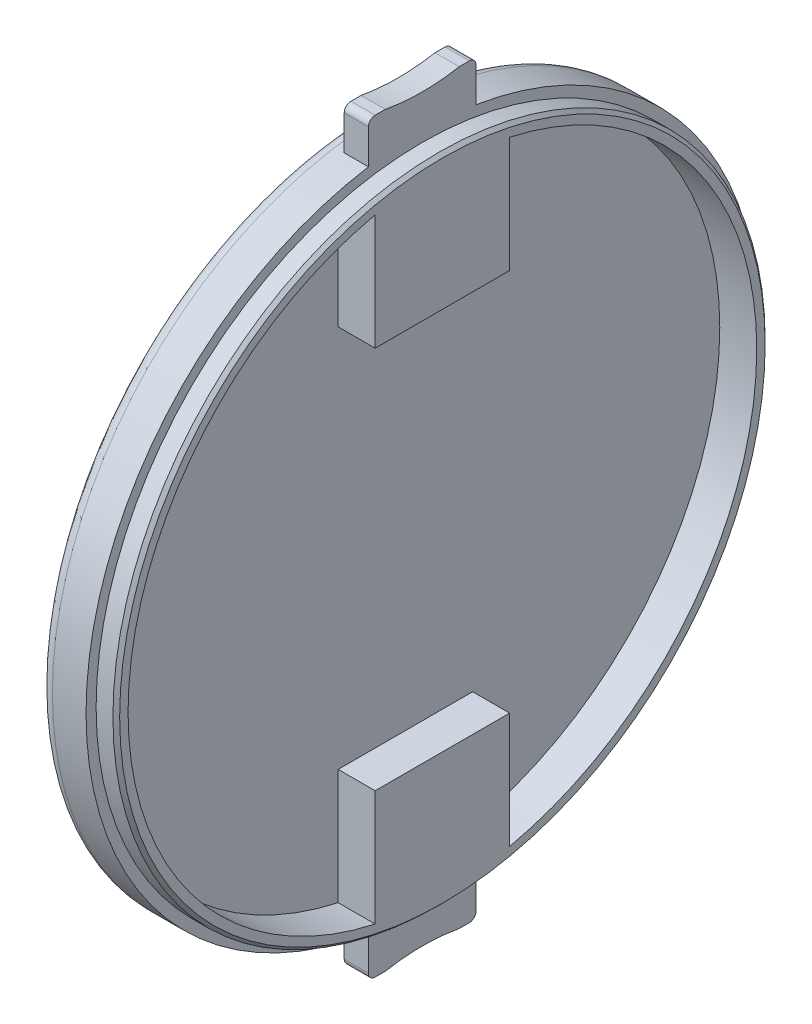
ISO-10303-21;
HEADER;
FILE_DESCRIPTION(('STEP AP214'),'2;1');
FILE_NAME('part.step','',(''),(''),'','','');
FILE_SCHEMA(('AUTOMOTIVE_DESIGN { 1 0 10303 214 1 1 1 1 }'));
ENDSEC;
DATA;
#1=APPLICATION_CONTEXT('core data for automotive mechanical design processes');
#2=APPLICATION_PROTOCOL_DEFINITION('international standard','automotive_design',2000,#1);
#3=PRODUCT_CONTEXT('',#1,'mechanical');
#4=PRODUCT('Part','Part','',(#3));
#5=PRODUCT_RELATED_PRODUCT_CATEGORY('part','',(#4));
#6=PRODUCT_DEFINITION_FORMATION('','',#4);
#7=PRODUCT_DEFINITION_CONTEXT('part definition',#1,'design');
#8=PRODUCT_DEFINITION('design','',#6,#7);
#9=PRODUCT_DEFINITION_SHAPE('','',#8);
#10=(LENGTH_UNIT() NAMED_UNIT(*) SI_UNIT(.MILLI.,.METRE.));
#11=(NAMED_UNIT(*) PLANE_ANGLE_UNIT() SI_UNIT($,.RADIAN.));
#12=(NAMED_UNIT(*) SI_UNIT($,.STERADIAN.) SOLID_ANGLE_UNIT());
#13=UNCERTAINTY_MEASURE_WITH_UNIT(LENGTH_MEASURE(1.E-05),#10,'distance_accuracy_value','');
#14=(GEOMETRIC_REPRESENTATION_CONTEXT(3) GLOBAL_UNCERTAINTY_ASSIGNED_CONTEXT((#13)) GLOBAL_UNIT_ASSIGNED_CONTEXT((#10,
#11,#12)) REPRESENTATION_CONTEXT('',''));
#15=CARTESIAN_POINT('',(0.,0.,0.));
#16=DIRECTION('',(0.,0.,1.));
#17=DIRECTION('',(1.,0.,0.));
#18=AXIS2_PLACEMENT_3D('',#15,#16,#17);
#19=CARTESIAN_POINT('',(0.,0.,0.));
#20=DIRECTION('',(1.,0.,0.));
#21=DIRECTION('',(0.,0.,-1.));
#22=AXIS2_PLACEMENT_3D('',#19,#20,#21);
#23=PLANE('',#22);
#24=DIRECTION('',(0.,0.,1.));
#25=VECTOR('',#24,1.);
#26=CARTESIAN_POINT('',(0.,-28.5,10.));
#27=LINE('',#26,#25);
#28=CARTESIAN_POINT('',(0.,-28.5,-10.));
#29=VERTEX_POINT('',#28);
#30=CARTESIAN_POINT('',(0.,-28.5,10.));
#31=VERTEX_POINT('',#30);
#32=EDGE_CURVE('E328',#29,#31,#27,.T.);
#33=ORIENTED_EDGE('',*,*,#32,.F.);
#34=DIRECTION('',(0.,1.,0.));
#35=VECTOR('',#34,1.);
#36=CARTESIAN_POINT('',(0.,-28.5,-10.));
#37=LINE('',#36,#35);
#38=CARTESIAN_POINT('',(0.,-45.6679592274496,-10.));
#39=VERTEX_POINT('',#38);
#40=EDGE_CURVE('E332',#39,#29,#37,.T.);
#41=ORIENTED_EDGE('',*,*,#40,.F.);
#42=CARTESIAN_POINT('',(0.,0.,0.));
#43=DIRECTION('',(1.,0.,0.));
#44=DIRECTION('',(0.,0.,-1.));
#45=AXIS2_PLACEMENT_3D('',#42,#43,#44);
#46=CIRCLE('',#45,46.75);
#47=CARTESIAN_POINT('',(0.,45.6679592274496,-9.99999999999999));
#48=VERTEX_POINT('',#47);
#49=EDGE_CURVE('E396',#39,#48,#46,.T.);
#50=ORIENTED_EDGE('',*,*,#49,.T.);
#51=DIRECTION('',(0.,1.,0.));
#52=VECTOR('',#51,1.);
#53=CARTESIAN_POINT('',(0.,45.6679592274496,-9.99999999999999));
#54=LINE('',#53,#52);
#55=CARTESIAN_POINT('',(0.,28.5,-9.99999999999999));
#56=VERTEX_POINT('',#55);
#57=EDGE_CURVE('E352',#56,#48,#54,.T.);
#58=ORIENTED_EDGE('',*,*,#57,.F.);
#59=DIRECTION('',(0.,0.,-1.));
#60=VECTOR('',#59,1.);
#61=CARTESIAN_POINT('',(0.,28.5,10.));
#62=LINE('',#61,#60);
#63=CARTESIAN_POINT('',(0.,28.5,10.));
#64=VERTEX_POINT('',#63);
#65=EDGE_CURVE('E357',#64,#56,#62,.T.);
#66=ORIENTED_EDGE('',*,*,#65,.F.);
#67=DIRECTION('',(0.,-1.,0.));
#68=VECTOR('',#67,1.);
#69=CARTESIAN_POINT('',(0.,45.6679592274496,10.));
#70=LINE('',#69,#68);
#71=CARTESIAN_POINT('',(0.,45.6679592274496,10.));
#72=VERTEX_POINT('',#71);
#73=EDGE_CURVE('E361',#72,#64,#70,.T.);
#74=ORIENTED_EDGE('',*,*,#73,.F.);
#75=CARTESIAN_POINT('',(0.,-45.6679592274496,9.99999999999999));
#76=VERTEX_POINT('',#75);
#77=EDGE_CURVE('E397',#72,#76,#46,.T.);
#78=ORIENTED_EDGE('',*,*,#77,.T.);
#79=DIRECTION('',(0.,-1.,0.));
#80=VECTOR('',#79,1.);
#81=CARTESIAN_POINT('',(0.,-28.5,10.));
#82=LINE('',#81,#80);
#83=EDGE_CURVE('E323',#31,#76,#82,.T.);
#84=ORIENTED_EDGE('',*,*,#83,.F.);
#85=EDGE_LOOP('',(#33,#41,#50,#58,#66,#74,#78,#84));
#86=FACE_BOUND('',#85,.T.);
#87=ADVANCED_FACE('F30',(#86),#23,.T.);
#88=CARTESIAN_POINT('',(0.,0.,0.));
#89=DIRECTION('',(1.,0.,0.));
#90=DIRECTION('',(0.,0.,-1.));
#91=AXIS2_PLACEMENT_3D('',#88,#89,#90);
#92=CYLINDRICAL_SURFACE('',#91,46.75);
#93=ORIENTED_EDGE('',*,*,#49,.F.);
#94=DIRECTION('',(-1.,0.,0.));
#95=VECTOR('',#94,1.);
#96=CARTESIAN_POINT('',(32.5751269618445,-45.6679592274496,-10.));
#97=LINE('',#96,#95);
#98=CARTESIAN_POINT('',(5.5,-45.6679592274496,-10.));
#99=VERTEX_POINT('',#98);
#100=EDGE_CURVE('E335',#99,#39,#97,.T.);
#101=ORIENTED_EDGE('',*,*,#100,.F.);
#102=CARTESIAN_POINT('',(5.5,0.,0.));
#103=DIRECTION('',(1.,0.,0.));
#104=DIRECTION('',(0.,0.,-1.));
#105=AXIS2_PLACEMENT_3D('',#102,#103,#104);
#106=CIRCLE('',#105,46.75);
#107=CARTESIAN_POINT('',(5.5,45.6679592274496,-9.99999999999999));
#108=VERTEX_POINT('',#107);
#109=EDGE_CURVE('E393',#99,#108,#106,.T.);
#110=ORIENTED_EDGE('',*,*,#109,.T.);
#111=DIRECTION('',(-1.,0.,0.));
#112=VECTOR('',#111,1.);
#113=CARTESIAN_POINT('',(32.5751269618445,45.6679592274496,-9.99999999999999));
#114=LINE('',#113,#112);
#115=EDGE_CURVE('E339',#108,#48,#114,.T.);
#116=ORIENTED_EDGE('',*,*,#115,.T.);
#117=EDGE_LOOP('',(#93,#101,#110,#116));
#118=FACE_BOUND('',#117,.T.);
#119=ADVANCED_FACE('F421',(#118),#92,.F.);
#120=CARTESIAN_POINT('',(5.5,45.6679592274496,10.));
#121=VERTEX_POINT('',#120);
#122=CARTESIAN_POINT('',(5.5,-45.6679592274496,9.99999999999999));
#123=VERTEX_POINT('',#122);
#124=EDGE_CURVE('E394',#121,#123,#106,.T.);
#125=ORIENTED_EDGE('',*,*,#124,.T.);
#126=DIRECTION('',(-1.,0.,0.));
#127=VECTOR('',#126,1.);
#128=CARTESIAN_POINT('',(32.5751269618445,-45.6679592274496,9.99999999999999));
#129=LINE('',#128,#127);
#130=EDGE_CURVE('E308',#123,#76,#129,.T.);
#131=ORIENTED_EDGE('',*,*,#130,.T.);
#132=ORIENTED_EDGE('',*,*,#77,.F.);
#133=DIRECTION('',(-1.,0.,0.));
#134=VECTOR('',#133,1.);
#135=CARTESIAN_POINT('',(32.5751269618445,45.6679592274496,10.));
#136=LINE('',#135,#134);
#137=EDGE_CURVE('E364',#121,#72,#136,.T.);
#138=ORIENTED_EDGE('',*,*,#137,.F.);
#139=EDGE_LOOP('',(#125,#131,#132,#138));
#140=FACE_BOUND('',#139,.T.);
#141=ADVANCED_FACE('F426',(#140),#92,.F.);
#142=CARTESIAN_POINT('',(5.5,46.75,0.));
#143=DIRECTION('',(1.,0.,0.));
#144=DIRECTION('',(0.,0.,-1.));
#145=AXIS2_PLACEMENT_3D('',#142,#143,#144);
#146=PLANE('',#145);
#147=CARTESIAN_POINT('',(5.5,0.,0.));
#148=DIRECTION('',(1.,0.,0.));
#149=DIRECTION('',(0.,0.,-1.));
#150=AXIS2_PLACEMENT_3D('',#147,#148,#149);
#151=CIRCLE('',#150,47.9999999999999);
#152=CARTESIAN_POINT('',(5.5,0.,-47.9999999999999));
#153=VERTEX_POINT('',#152);
#154=EDGE_CURVE('E38',#153,#153,#151,.T.);
#155=ORIENTED_EDGE('',*,*,#154,.T.);
#156=EDGE_LOOP('',(#155));
#157=FACE_BOUND('',#156,.T.);
#158=ORIENTED_EDGE('',*,*,#124,.F.);
#159=DIRECTION('',(0.,-1.,0.));
#160=VECTOR('',#159,1.);
#161=CARTESIAN_POINT('',(5.5,45.6679592274496,10.));
#162=LINE('',#161,#160);
#163=CARTESIAN_POINT('',(5.5,28.5,10.));
#164=VERTEX_POINT('',#163);
#165=EDGE_CURVE('E369',#121,#164,#162,.T.);
#166=ORIENTED_EDGE('',*,*,#165,.T.);
#167=DIRECTION('',(0.,0.,-1.));
#168=VECTOR('',#167,1.);
#169=CARTESIAN_POINT('',(5.5,28.5,10.));
#170=LINE('',#169,#168);
#171=CARTESIAN_POINT('',(5.5,28.5,-9.99999999999999));
#172=VERTEX_POINT('',#171);
#173=EDGE_CURVE('E365',#164,#172,#170,.T.);
#174=ORIENTED_EDGE('',*,*,#173,.T.);
#175=DIRECTION('',(0.,1.,0.));
#176=VECTOR('',#175,1.);
#177=CARTESIAN_POINT('',(5.5,45.6679592274496,-9.99999999999999));
#178=LINE('',#177,#176);
#179=EDGE_CURVE('E355',#172,#108,#178,.T.);
#180=ORIENTED_EDGE('',*,*,#179,.T.);
#181=ORIENTED_EDGE('',*,*,#109,.F.);
#182=DIRECTION('',(0.,1.,0.));
#183=VECTOR('',#182,1.);
#184=CARTESIAN_POINT('',(5.5,-28.5,-10.));
#185=LINE('',#184,#183);
#186=CARTESIAN_POINT('',(5.5,-28.5,-10.));
#187=VERTEX_POINT('',#186);
#188=EDGE_CURVE('E340',#99,#187,#185,.T.);
#189=ORIENTED_EDGE('',*,*,#188,.T.);
#190=DIRECTION('',(0.,0.,1.));
#191=VECTOR('',#190,1.);
#192=CARTESIAN_POINT('',(5.5,-28.5,10.));
#193=LINE('',#192,#191);
#194=CARTESIAN_POINT('',(5.5,-28.5,10.));
#195=VERTEX_POINT('',#194);
#196=EDGE_CURVE('E336',#187,#195,#193,.T.);
#197=ORIENTED_EDGE('',*,*,#196,.T.);
#198=DIRECTION('',(0.,-1.,0.));
#199=VECTOR('',#198,1.);
#200=CARTESIAN_POINT('',(5.5,-28.5,10.));
#201=LINE('',#200,#199);
#202=EDGE_CURVE('E326',#195,#123,#201,.T.);
#203=ORIENTED_EDGE('',*,*,#202,.T.);
#204=EDGE_LOOP('',(#158,#166,#174,#180,#181,#189,#197,#203));
#205=FACE_BOUND('',#204,.T.);
#206=ADVANCED_FACE('F402',(#157,#205),#146,.T.);
#207=CARTESIAN_POINT('',(0.,0.,0.));
#208=DIRECTION('',(1.,0.,0.));
#209=DIRECTION('',(0.,0.,-1.));
#210=AXIS2_PLACEMENT_3D('',#207,#208,#209);
#211=CYLINDRICAL_SURFACE('',#210,48.5);
#212=CARTESIAN_POINT('',(4.99999999999998,0.,0.));
#213=DIRECTION('',(1.,0.,0.));
#214=DIRECTION('',(0.,0.,-1.));
#215=AXIS2_PLACEMENT_3D('',#212,#213,#214);
#216=CIRCLE('',#215,48.5);
#217=CARTESIAN_POINT('',(4.99999999999998,0.,-48.5));
#218=VERTEX_POINT('',#217);
#219=EDGE_CURVE('E11',#218,#218,#216,.F.);
#220=ORIENTED_EDGE('',*,*,#219,.T.);
#221=EDGE_LOOP('',(#220));
#222=FACE_BOUND('',#221,.T.);
#223=CARTESIAN_POINT('',(2.5,0.,0.));
#224=DIRECTION('',(1.,0.,0.));
#225=DIRECTION('',(0.,0.,-1.));
#226=AXIS2_PLACEMENT_3D('',#223,#224,#225);
#227=CIRCLE('',#226,48.5);
#228=CARTESIAN_POINT('',(2.5,0.,-48.5));
#229=VERTEX_POINT('',#228);
#230=EDGE_CURVE('E390',#229,#229,#227,.T.);
#231=ORIENTED_EDGE('',*,*,#230,.T.);
#232=EDGE_LOOP('',(#231));
#233=FACE_BOUND('',#232,.T.);
#234=ADVANCED_FACE('F432',(#222,#233),#211,.T.);
#235=CARTESIAN_POINT('',(2.5,48.5,0.));
#236=DIRECTION('',(1.,0.,0.));
#237=DIRECTION('',(0.,0.,-1.));
#238=AXIS2_PLACEMENT_3D('',#235,#236,#237);
#239=PLANE('',#238);
#240=CARTESIAN_POINT('',(2.5,0.,0.));
#241=DIRECTION('',(1.,0.,0.));
#242=DIRECTION('',(0.,0.,-1.));
#243=AXIS2_PLACEMENT_3D('',#240,#241,#242);
#244=CIRCLE('',#243,50.);
#245=CARTESIAN_POINT('',(2.5,49.3558507170123,8.00000000000001));
#246=VERTEX_POINT('',#245);
#247=CARTESIAN_POINT('',(2.5,-49.3558507170122,8.));
#248=VERTEX_POINT('',#247);
#249=EDGE_CURVE('E388',#246,#248,#244,.T.);
#250=ORIENTED_EDGE('',*,*,#249,.T.);
#251=DIRECTION('',(0.,-1.,0.));
#252=VECTOR('',#251,1.);
#253=CARTESIAN_POINT('',(2.5,-54.5,7.99999999999999));
#254=LINE('',#253,#252);
#255=CARTESIAN_POINT('',(2.5,-54.5,7.99999999999999));
#256=VERTEX_POINT('',#255);
#257=EDGE_CURVE('E245',#248,#256,#254,.T.);
#258=ORIENTED_EDGE('',*,*,#257,.T.);
#259=CARTESIAN_POINT('',(2.5,-54.5,6.99999999999999));
#260=DIRECTION('',(1.,0.,0.));
#261=DIRECTION('',(0.,0.,1.));
#262=AXIS2_PLACEMENT_3D('',#259,#260,#261);
#263=CIRCLE('',#262,1.);
#264=CARTESIAN_POINT('',(2.5,-55.5,6.99999999999999));
#265=VERTEX_POINT('',#264);
#266=EDGE_CURVE('E222',#256,#265,#263,.T.);
#267=ORIENTED_EDGE('',*,*,#266,.T.);
#268=DIRECTION('',(0.,0.,-1.));
#269=VECTOR('',#268,1.);
#270=CARTESIAN_POINT('',(2.5,-55.5,5.49999999999999));
#271=LINE('',#270,#269);
#272=CARTESIAN_POINT('',(2.5,-55.5,5.49999999999999));
#273=VERTEX_POINT('',#272);
#274=EDGE_CURVE('E219',#265,#273,#271,.T.);
#275=ORIENTED_EDGE('',*,*,#274,.T.);
#276=CARTESIAN_POINT('',(2.5,-85.5,0.));
#277=DIRECTION('',(-1.,0.,0.));
#278=DIRECTION('',(0.,0.,1.));
#279=AXIS2_PLACEMENT_3D('',#276,#277,#278);
#280=CIRCLE('',#279,30.5);
#281=CARTESIAN_POINT('',(2.5,-55.5,-5.50000000000001));
#282=VERTEX_POINT('',#281);
#283=EDGE_CURVE('E239',#273,#282,#280,.T.);
#284=ORIENTED_EDGE('',*,*,#283,.T.);
#285=DIRECTION('',(0.,0.,-1.));
#286=VECTOR('',#285,1.);
#287=CARTESIAN_POINT('',(2.5,-55.5,-7.));
#288=LINE('',#287,#286);
#289=CARTESIAN_POINT('',(2.5,-55.5,-7.));
#290=VERTEX_POINT('',#289);
#291=EDGE_CURVE('E198',#282,#290,#288,.T.);
#292=ORIENTED_EDGE('',*,*,#291,.T.);
#293=CARTESIAN_POINT('',(2.5,-54.5,-7.00000000000001));
#294=DIRECTION('',(1.,0.,0.));
#295=DIRECTION('',(0.,0.,1.));
#296=AXIS2_PLACEMENT_3D('',#293,#294,#295);
#297=CIRCLE('',#296,1.);
#298=CARTESIAN_POINT('',(2.5,-54.5,-8.00000000000001));
#299=VERTEX_POINT('',#298);
#300=EDGE_CURVE('E242',#290,#299,#297,.T.);
#301=ORIENTED_EDGE('',*,*,#300,.T.);
#302=DIRECTION('',(0.,1.,0.));
#303=VECTOR('',#302,1.);
#304=CARTESIAN_POINT('',(2.5,-54.5,-8.00000000000001));
#305=LINE('',#304,#303);
#306=CARTESIAN_POINT('',(2.5,-49.3558507170123,-8.00000000000001));
#307=VERTEX_POINT('',#306);
#308=EDGE_CURVE('E45',#299,#307,#305,.T.);
#309=ORIENTED_EDGE('',*,*,#308,.T.);
#310=CARTESIAN_POINT('',(2.5,49.3558507170122,-8.));
#311=VERTEX_POINT('',#310);
#312=EDGE_CURVE('E387',#307,#311,#244,.T.);
#313=ORIENTED_EDGE('',*,*,#312,.T.);
#314=DIRECTION('',(0.,1.,0.));
#315=VECTOR('',#314,1.);
#316=CARTESIAN_POINT('',(2.5,54.5,-7.99999999999999));
#317=LINE('',#316,#315);
#318=CARTESIAN_POINT('',(2.5,54.5,-7.99999999999999));
#319=VERTEX_POINT('',#318);
#320=EDGE_CURVE('E298',#311,#319,#317,.T.);
#321=ORIENTED_EDGE('',*,*,#320,.T.);
#322=CARTESIAN_POINT('',(2.5,54.5,-6.99999999999999));
#323=DIRECTION('',(1.,0.,0.));
#324=DIRECTION('',(0.,0.,-1.));
#325=AXIS2_PLACEMENT_3D('',#322,#323,#324);
#326=CIRCLE('',#325,1.);
#327=CARTESIAN_POINT('',(2.5,55.5,-6.99999999999999));
#328=VERTEX_POINT('',#327);
#329=EDGE_CURVE('E301',#319,#328,#326,.T.);
#330=ORIENTED_EDGE('',*,*,#329,.T.);
#331=DIRECTION('',(0.,0.,1.));
#332=VECTOR('',#331,1.);
#333=CARTESIAN_POINT('',(2.5,55.5,-5.49999999999999));
#334=LINE('',#333,#332);
#335=CARTESIAN_POINT('',(2.5,55.5,-5.49999999999999));
#336=VERTEX_POINT('',#335);
#337=EDGE_CURVE('E268',#328,#336,#334,.T.);
#338=ORIENTED_EDGE('',*,*,#337,.T.);
#339=CARTESIAN_POINT('',(2.5,85.5,0.));
#340=DIRECTION('',(-1.,0.,0.));
#341=DIRECTION('',(0.,0.,-1.));
#342=AXIS2_PLACEMENT_3D('',#339,#340,#341);
#343=CIRCLE('',#342,30.5);
#344=CARTESIAN_POINT('',(2.5,55.5,5.50000000000001));
#345=VERTEX_POINT('',#344);
#346=EDGE_CURVE('E251',#336,#345,#343,.T.);
#347=ORIENTED_EDGE('',*,*,#346,.T.);
#348=DIRECTION('',(0.,0.,1.));
#349=VECTOR('',#348,1.);
#350=CARTESIAN_POINT('',(2.5,55.5,7.));
#351=LINE('',#350,#349);
#352=CARTESIAN_POINT('',(2.5,55.5,7.));
#353=VERTEX_POINT('',#352);
#354=EDGE_CURVE('E292',#345,#353,#351,.T.);
#355=ORIENTED_EDGE('',*,*,#354,.T.);
#356=CARTESIAN_POINT('',(2.5,54.5,7.00000000000001));
#357=DIRECTION('',(1.,0.,0.));
#358=DIRECTION('',(0.,0.,-1.));
#359=AXIS2_PLACEMENT_3D('',#356,#357,#358);
#360=CIRCLE('',#359,1.);
#361=CARTESIAN_POINT('',(2.5,54.5,8.00000000000001));
#362=VERTEX_POINT('',#361);
#363=EDGE_CURVE('E295',#353,#362,#360,.T.);
#364=ORIENTED_EDGE('',*,*,#363,.T.);
#365=DIRECTION('',(0.,-1.,0.));
#366=VECTOR('',#365,1.);
#367=CARTESIAN_POINT('',(2.5,54.5,8.00000000000001));
#368=LINE('',#367,#366);
#369=EDGE_CURVE('E52',#362,#246,#368,.T.);
#370=ORIENTED_EDGE('',*,*,#369,.T.);
#371=EDGE_LOOP('',(#250,#258,#267,#275,#284,#292,#301,#309,#313,#321,#330,#338,#347,#355,#364,#370));
#372=FACE_BOUND('',#371,.T.);
#373=ORIENTED_EDGE('',*,*,#230,.F.);
#374=EDGE_LOOP('',(#373));
#375=FACE_BOUND('',#374,.T.);
#376=ADVANCED_FACE('F435',(#372,#375),#239,.T.);
#377=CARTESIAN_POINT('',(0.,0.,0.));
#378=DIRECTION('',(1.,0.,0.));
#379=DIRECTION('',(0.,0.,-1.));
#380=AXIS2_PLACEMENT_3D('',#377,#378,#379);
#381=CYLINDRICAL_SURFACE('',#380,50.);
#382=DIRECTION('',(1.,0.,0.));
#383=VECTOR('',#382,1.);
#384=CARTESIAN_POINT('',(-1.1,-49.3558507170122,8.));
#385=LINE('',#384,#383);
#386=CARTESIAN_POINT('',(-1.1,-49.3558507170122,8.));
#387=VERTEX_POINT('',#386);
#388=EDGE_CURVE('E256',#387,#248,#385,.T.);
#389=ORIENTED_EDGE('',*,*,#388,.T.);
#390=ORIENTED_EDGE('',*,*,#249,.F.);
#391=DIRECTION('',(1.,0.,0.));
#392=VECTOR('',#391,1.);
#393=CARTESIAN_POINT('',(-1.1,49.3558507170123,8.00000000000001));
#394=LINE('',#393,#392);
#395=CARTESIAN_POINT('',(-1.1,49.3558507170123,8.00000000000001));
#396=VERTEX_POINT('',#395);
#397=EDGE_CURVE('E316',#396,#246,#394,.T.);
#398=ORIENTED_EDGE('',*,*,#397,.F.);
#399=CARTESIAN_POINT('',(-1.1,0.,0.));
#400=DIRECTION('',(-1.,0.,0.));
#401=DIRECTION('',(0.,0.,-1.));
#402=AXIS2_PLACEMENT_3D('',#399,#400,#401);
#403=CIRCLE('',#402,50.);
#404=CARTESIAN_POINT('',(-1.1,49.3558507170122,-8.));
#405=VERTEX_POINT('',#404);
#406=EDGE_CURVE('E277',#396,#405,#403,.T.);
#407=ORIENTED_EDGE('',*,*,#406,.T.);
#408=DIRECTION('',(1.,0.,0.));
#409=VECTOR('',#408,1.);
#410=CARTESIAN_POINT('',(-1.1,49.3558507170122,-8.));
#411=LINE('',#410,#409);
#412=EDGE_CURVE('E313',#405,#311,#411,.T.);
#413=ORIENTED_EDGE('',*,*,#412,.T.);
#414=ORIENTED_EDGE('',*,*,#312,.F.);
#415=DIRECTION('',(1.,0.,0.));
#416=VECTOR('',#415,1.);
#417=CARTESIAN_POINT('',(-1.1,-49.3558507170123,-8.00000000000001));
#418=LINE('',#417,#416);
#419=CARTESIAN_POINT('',(-1.1,-49.3558507170123,-8.00000000000001));
#420=VERTEX_POINT('',#419);
#421=EDGE_CURVE('E259',#420,#307,#418,.T.);
#422=ORIENTED_EDGE('',*,*,#421,.F.);
#423=CARTESIAN_POINT('',(-1.1,0.,0.));
#424=DIRECTION('',(-1.,0.,0.));
#425=DIRECTION('',(0.,0.,1.));
#426=AXIS2_PLACEMENT_3D('',#423,#424,#425);
#427=CIRCLE('',#426,50.);
#428=EDGE_CURVE('E229',#420,#387,#427,.T.);
#429=ORIENTED_EDGE('',*,*,#428,.T.);
#430=EDGE_LOOP('',(#389,#390,#398,#407,#413,#414,#422,#429));
#431=FACE_BOUND('',#430,.T.);
#432=CARTESIAN_POINT('',(-2.49999999999999,0.,0.));
#433=DIRECTION('',(1.,0.,0.));
#434=DIRECTION('',(0.,0.,-1.));
#435=AXIS2_PLACEMENT_3D('',#432,#433,#434);
#436=CIRCLE('',#435,50.);
#437=CARTESIAN_POINT('',(-2.49999999999999,0.,-50.));
#438=VERTEX_POINT('',#437);
#439=EDGE_CURVE('E384',#438,#438,#436,.T.);
#440=ORIENTED_EDGE('',*,*,#439,.T.);
#441=EDGE_LOOP('',(#440));
#442=FACE_BOUND('',#441,.T.);
#443=ADVANCED_FACE('F439',(#431,#442),#381,.T.);
#444=CARTESIAN_POINT('',(-2.5,0.,0.));
#445=DIRECTION('',(1.,0.,0.));
#446=DIRECTION('',(0.,0.,-1.));
#447=AXIS2_PLACEMENT_3D('',#444,#445,#446);
#448=TOROIDAL_SURFACE('',#447,48.,2.);
#449=CARTESIAN_POINT('',(-4.5,0.,0.));
#450=DIRECTION('',(1.,0.,0.));
#451=DIRECTION('',(0.,0.,-1.));
#452=AXIS2_PLACEMENT_3D('',#449,#450,#451);
#453=CIRCLE('',#452,48.);
#454=CARTESIAN_POINT('',(-4.5,0.,-48.));
#455=VERTEX_POINT('',#454);
#456=EDGE_CURVE('E368',#455,#455,#453,.T.);
#457=ORIENTED_EDGE('',*,*,#456,.T.);
#458=EDGE_LOOP('',(#457));
#459=FACE_BOUND('',#458,.T.);
#460=ORIENTED_EDGE('',*,*,#439,.F.);
#461=EDGE_LOOP('',(#460));
#462=FACE_BOUND('',#461,.T.);
#463=ADVANCED_FACE('F416',(#459,#462),#448,.T.);
#464=CARTESIAN_POINT('',(-4.5,48.,0.));
#465=DIRECTION('',(-1.,0.,0.));
#466=DIRECTION('',(0.,0.,1.));
#467=AXIS2_PLACEMENT_3D('',#464,#465,#466);
#468=PLANE('',#467);
#469=ORIENTED_EDGE('',*,*,#456,.F.);
#470=EDGE_LOOP('',(#469));
#471=FACE_BOUND('',#470,.T.);
#472=ADVANCED_FACE('F407',(#471),#468,.T.);
#473=CARTESIAN_POINT('',(5.5,0.,0.));
#474=DIRECTION('',(-1.,0.,0.));
#475=DIRECTION('',(0.,0.,1.));
#476=AXIS2_PLACEMENT_3D('',#473,#474,#475);
#477=CONICAL_SURFACE('',#476,47.9999999999999,0.785398163397441);
#478=ORIENTED_EDGE('',*,*,#219,.F.);
#479=EDGE_LOOP('',(#478));
#480=FACE_BOUND('',#479,.T.);
#481=ORIENTED_EDGE('',*,*,#154,.F.);
#482=EDGE_LOOP('',(#481));
#483=FACE_BOUND('',#482,.T.);
#484=ADVANCED_FACE('F32',(#480,#483),#477,.T.);
#485=CARTESIAN_POINT('',(32.5751269618445,45.6679592274496,10.));
#486=DIRECTION('',(0.,0.,-1.));
#487=DIRECTION('',(0.,1.,0.));
#488=AXIS2_PLACEMENT_3D('',#485,#486,#487);
#489=PLANE('',#488);
#490=ORIENTED_EDGE('',*,*,#165,.F.);
#491=ORIENTED_EDGE('',*,*,#137,.T.);
#492=ORIENTED_EDGE('',*,*,#73,.T.);
#493=DIRECTION('',(-1.,0.,0.));
#494=VECTOR('',#493,1.);
#495=CARTESIAN_POINT('',(32.5751269618445,28.5,10.));
#496=LINE('',#495,#494);
#497=EDGE_CURVE('E360',#164,#64,#496,.T.);
#498=ORIENTED_EDGE('',*,*,#497,.F.);
#499=EDGE_LOOP('',(#490,#491,#492,#498));
#500=FACE_BOUND('',#499,.T.);
#501=ADVANCED_FACE('F406',(#500),#489,.F.);
#502=CARTESIAN_POINT('',(32.5751269618445,28.5,10.));
#503=DIRECTION('',(0.,1.,0.));
#504=DIRECTION('',(0.,0.,1.));
#505=AXIS2_PLACEMENT_3D('',#502,#503,#504);
#506=PLANE('',#505);
#507=ORIENTED_EDGE('',*,*,#173,.F.);
#508=ORIENTED_EDGE('',*,*,#497,.T.);
#509=ORIENTED_EDGE('',*,*,#65,.T.);
#510=DIRECTION('',(-1.,0.,0.));
#511=VECTOR('',#510,1.);
#512=CARTESIAN_POINT('',(32.5751269618445,28.5,-9.99999999999999));
#513=LINE('',#512,#511);
#514=EDGE_CURVE('E356',#172,#56,#513,.T.);
#515=ORIENTED_EDGE('',*,*,#514,.F.);
#516=EDGE_LOOP('',(#507,#508,#509,#515));
#517=FACE_BOUND('',#516,.T.);
#518=ADVANCED_FACE('F413',(#517),#506,.F.);
#519=CARTESIAN_POINT('',(32.5751269618445,45.6679592274496,-9.99999999999999));
#520=DIRECTION('',(0.,0.,1.));
#521=DIRECTION('',(1.,0.,0.));
#522=AXIS2_PLACEMENT_3D('',#519,#520,#521);
#523=PLANE('',#522);
#524=ORIENTED_EDGE('',*,*,#179,.F.);
#525=ORIENTED_EDGE('',*,*,#514,.T.);
#526=ORIENTED_EDGE('',*,*,#57,.T.);
#527=ORIENTED_EDGE('',*,*,#115,.F.);
#528=EDGE_LOOP('',(#524,#525,#526,#527));
#529=FACE_BOUND('',#528,.T.);
#530=ADVANCED_FACE('F448',(#529),#523,.F.);
#531=CARTESIAN_POINT('',(32.5751269618445,-28.5,-10.));
#532=DIRECTION('',(0.,0.,1.));
#533=DIRECTION('',(0.,-1.,0.));
#534=AXIS2_PLACEMENT_3D('',#531,#532,#533);
#535=PLANE('',#534);
#536=ORIENTED_EDGE('',*,*,#188,.F.);
#537=ORIENTED_EDGE('',*,*,#100,.T.);
#538=ORIENTED_EDGE('',*,*,#40,.T.);
#539=DIRECTION('',(-1.,0.,0.));
#540=VECTOR('',#539,1.);
#541=CARTESIAN_POINT('',(32.5751269618445,-28.5,-10.));
#542=LINE('',#541,#540);
#543=EDGE_CURVE('E331',#187,#29,#542,.T.);
#544=ORIENTED_EDGE('',*,*,#543,.F.);
#545=EDGE_LOOP('',(#536,#537,#538,#544));
#546=FACE_BOUND('',#545,.T.);
#547=ADVANCED_FACE('F452',(#546),#535,.F.);
#548=CARTESIAN_POINT('',(32.5751269618445,-28.5,10.));
#549=DIRECTION('',(0.,-1.,0.));
#550=DIRECTION('',(0.,0.,-1.));
#551=AXIS2_PLACEMENT_3D('',#548,#549,#550);
#552=PLANE('',#551);
#553=ORIENTED_EDGE('',*,*,#196,.F.);
#554=ORIENTED_EDGE('',*,*,#543,.T.);
#555=ORIENTED_EDGE('',*,*,#32,.T.);
#556=DIRECTION('',(-1.,0.,0.));
#557=VECTOR('',#556,1.);
#558=CARTESIAN_POINT('',(32.5751269618445,-28.5,10.));
#559=LINE('',#558,#557);
#560=EDGE_CURVE('E327',#195,#31,#559,.T.);
#561=ORIENTED_EDGE('',*,*,#560,.F.);
#562=EDGE_LOOP('',(#553,#554,#555,#561));
#563=FACE_BOUND('',#562,.T.);
#564=ADVANCED_FACE('F456',(#563),#552,.F.);
#565=CARTESIAN_POINT('',(32.5751269618445,-28.5,10.));
#566=DIRECTION('',(0.,0.,-1.));
#567=DIRECTION('',(0.,1.,0.));
#568=AXIS2_PLACEMENT_3D('',#565,#566,#567);
#569=PLANE('',#568);
#570=ORIENTED_EDGE('',*,*,#202,.F.);
#571=ORIENTED_EDGE('',*,*,#560,.T.);
#572=ORIENTED_EDGE('',*,*,#83,.T.);
#573=ORIENTED_EDGE('',*,*,#130,.F.);
#574=EDGE_LOOP('',(#570,#571,#572,#573));
#575=FACE_BOUND('',#574,.T.);
#576=ADVANCED_FACE('F460',(#575),#569,.F.);
#577=CARTESIAN_POINT('',(-1.1,85.5,0.));
#578=DIRECTION('',(1.,0.,0.));
#579=DIRECTION('',(0.,0.,-1.));
#580=AXIS2_PLACEMENT_3D('',#577,#578,#579);
#581=CYLINDRICAL_SURFACE('',#580,30.5);
#582=ORIENTED_EDGE('',*,*,#346,.F.);
#583=DIRECTION('',(1.,0.,0.));
#584=VECTOR('',#583,1.);
#585=CARTESIAN_POINT('',(-1.1,55.5,-5.49999999999999));
#586=LINE('',#585,#584);
#587=CARTESIAN_POINT('',(-1.1,55.5,-5.49999999999999));
#588=VERTEX_POINT('',#587);
#589=EDGE_CURVE('E306',#588,#336,#586,.T.);
#590=ORIENTED_EDGE('',*,*,#589,.F.);
#591=CARTESIAN_POINT('',(-1.1,85.5,0.));
#592=DIRECTION('',(-1.,0.,0.));
#593=DIRECTION('',(0.,0.,-1.));
#594=AXIS2_PLACEMENT_3D('',#591,#592,#593);
#595=CIRCLE('',#594,30.5);
#596=CARTESIAN_POINT('',(-1.1,55.5,5.50000000000001));
#597=VERTEX_POINT('',#596);
#598=EDGE_CURVE('E264',#588,#597,#595,.T.);
#599=ORIENTED_EDGE('',*,*,#598,.T.);
#600=DIRECTION('',(1.,0.,0.));
#601=VECTOR('',#600,1.);
#602=CARTESIAN_POINT('',(-1.1,55.5,5.50000000000001));
#603=LINE('',#602,#601);
#604=EDGE_CURVE('E289',#597,#345,#603,.T.);
#605=ORIENTED_EDGE('',*,*,#604,.T.);
#606=EDGE_LOOP('',(#582,#590,#599,#605));
#607=FACE_BOUND('',#606,.T.);
#608=ADVANCED_FACE('F464',(#607),#581,.F.);
#609=CARTESIAN_POINT('',(-1.1,55.5,-5.49999999999999));
#610=DIRECTION('',(0.,1.,0.));
#611=DIRECTION('',(0.,0.,1.));
#612=AXIS2_PLACEMENT_3D('',#609,#610,#611);
#613=PLANE('',#612);
#614=ORIENTED_EDGE('',*,*,#337,.F.);
#615=DIRECTION('',(1.,0.,0.));
#616=VECTOR('',#615,1.);
#617=CARTESIAN_POINT('',(-1.1,55.5,-6.99999999999999));
#618=LINE('',#617,#616);
#619=CARTESIAN_POINT('',(-1.1,55.5,-6.99999999999999));
#620=VERTEX_POINT('',#619);
#621=EDGE_CURVE('E309',#620,#328,#618,.T.);
#622=ORIENTED_EDGE('',*,*,#621,.F.);
#623=DIRECTION('',(0.,0.,1.));
#624=VECTOR('',#623,1.);
#625=CARTESIAN_POINT('',(-1.1,55.5,-5.49999999999999));
#626=LINE('',#625,#624);
#627=EDGE_CURVE('E286',#620,#588,#626,.T.);
#628=ORIENTED_EDGE('',*,*,#627,.T.);
#629=ORIENTED_EDGE('',*,*,#589,.T.);
#630=EDGE_LOOP('',(#614,#622,#628,#629));
#631=FACE_BOUND('',#630,.T.);
#632=ADVANCED_FACE('F468',(#631),#613,.T.);
#633=CARTESIAN_POINT('',(-1.1,54.5,-6.99999999999999));
#634=DIRECTION('',(1.,0.,0.));
#635=DIRECTION('',(0.,0.,-1.));
#636=AXIS2_PLACEMENT_3D('',#633,#634,#635);
#637=CYLINDRICAL_SURFACE('',#636,1.);
#638=ORIENTED_EDGE('',*,*,#329,.F.);
#639=DIRECTION('',(1.,0.,0.));
#640=VECTOR('',#639,1.);
#641=CARTESIAN_POINT('',(-1.1,54.5,-7.99999999999999));
#642=LINE('',#641,#640);
#643=CARTESIAN_POINT('',(-1.1,54.5,-7.99999999999999));
#644=VERTEX_POINT('',#643);
#645=EDGE_CURVE('E311',#644,#319,#642,.T.);
#646=ORIENTED_EDGE('',*,*,#645,.F.);
#647=CARTESIAN_POINT('',(-1.1,54.5,-6.99999999999999));
#648=DIRECTION('',(1.,0.,0.));
#649=DIRECTION('',(0.,0.,-1.));
#650=AXIS2_PLACEMENT_3D('',#647,#648,#649);
#651=CIRCLE('',#650,1.);
#652=EDGE_CURVE('E283',#644,#620,#651,.T.);
#653=ORIENTED_EDGE('',*,*,#652,.T.);
#654=ORIENTED_EDGE('',*,*,#621,.T.);
#655=EDGE_LOOP('',(#638,#646,#653,#654));
#656=FACE_BOUND('',#655,.T.);
#657=ADVANCED_FACE('F486',(#656),#637,.T.);
#658=CARTESIAN_POINT('',(-1.1,54.5,-7.99999999999999));
#659=DIRECTION('',(0.,0.,-1.));
#660=DIRECTION('',(0.,1.,0.));
#661=AXIS2_PLACEMENT_3D('',#658,#659,#660);
#662=PLANE('',#661);
#663=ORIENTED_EDGE('',*,*,#320,.F.);
#664=ORIENTED_EDGE('',*,*,#412,.F.);
#665=DIRECTION('',(0.,1.,0.));
#666=VECTOR('',#665,1.);
#667=CARTESIAN_POINT('',(-1.1,54.5,-7.99999999999999));
#668=LINE('',#667,#666);
#669=EDGE_CURVE('E280',#405,#644,#668,.T.);
#670=ORIENTED_EDGE('',*,*,#669,.T.);
#671=ORIENTED_EDGE('',*,*,#645,.T.);
#672=EDGE_LOOP('',(#663,#664,#670,#671));
#673=FACE_BOUND('',#672,.T.);
#674=ADVANCED_FACE('F482',(#673),#662,.T.);
#675=CARTESIAN_POINT('',(-1.1,54.5,8.00000000000001));
#676=DIRECTION('',(0.,0.,1.));
#677=DIRECTION('',(0.,-1.,0.));
#678=AXIS2_PLACEMENT_3D('',#675,#676,#677);
#679=PLANE('',#678);
#680=ORIENTED_EDGE('',*,*,#369,.F.);
#681=DIRECTION('',(1.,0.,0.));
#682=VECTOR('',#681,1.);
#683=CARTESIAN_POINT('',(-1.1,54.5,8.00000000000001));
#684=LINE('',#683,#682);
#685=CARTESIAN_POINT('',(-1.1,54.5,8.00000000000001));
#686=VERTEX_POINT('',#685);
#687=EDGE_CURVE('E318',#686,#362,#684,.T.);
#688=ORIENTED_EDGE('',*,*,#687,.F.);
#689=DIRECTION('',(0.,-1.,0.));
#690=VECTOR('',#689,1.);
#691=CARTESIAN_POINT('',(-1.1,54.5,8.00000000000001));
#692=LINE('',#691,#690);
#693=EDGE_CURVE('E274',#686,#396,#692,.T.);
#694=ORIENTED_EDGE('',*,*,#693,.T.);
#695=ORIENTED_EDGE('',*,*,#397,.T.);
#696=EDGE_LOOP('',(#680,#688,#694,#695));
#697=FACE_BOUND('',#696,.T.);
#698=ADVANCED_FACE('F478',(#697),#679,.T.);
#699=CARTESIAN_POINT('',(-1.1,54.5,7.00000000000001));
#700=DIRECTION('',(1.,0.,0.));
#701=DIRECTION('',(0.,0.,-1.));
#702=AXIS2_PLACEMENT_3D('',#699,#700,#701);
#703=CYLINDRICAL_SURFACE('',#702,1.);
#704=ORIENTED_EDGE('',*,*,#363,.F.);
#705=DIRECTION('',(1.,0.,0.));
#706=VECTOR('',#705,1.);
#707=CARTESIAN_POINT('',(-1.1,55.5,7.));
#708=LINE('',#707,#706);
#709=CARTESIAN_POINT('',(-1.1,55.5,7.));
#710=VERTEX_POINT('',#709);
#711=EDGE_CURVE('E320',#710,#353,#708,.T.);
#712=ORIENTED_EDGE('',*,*,#711,.F.);
#713=CARTESIAN_POINT('',(-1.1,54.5,7.00000000000001));
#714=DIRECTION('',(1.,0.,0.));
#715=DIRECTION('',(0.,0.,-1.));
#716=AXIS2_PLACEMENT_3D('',#713,#714,#715);
#717=CIRCLE('',#716,1.);
#718=EDGE_CURVE('E271',#710,#686,#717,.T.);
#719=ORIENTED_EDGE('',*,*,#718,.T.);
#720=ORIENTED_EDGE('',*,*,#687,.T.);
#721=EDGE_LOOP('',(#704,#712,#719,#720));
#722=FACE_BOUND('',#721,.T.);
#723=ADVANCED_FACE('F474',(#722),#703,.T.);
#724=CARTESIAN_POINT('',(-1.1,55.5,7.));
#725=DIRECTION('',(0.,1.,0.));
#726=DIRECTION('',(0.,0.,1.));
#727=AXIS2_PLACEMENT_3D('',#724,#725,#726);
#728=PLANE('',#727);
#729=ORIENTED_EDGE('',*,*,#354,.F.);
#730=ORIENTED_EDGE('',*,*,#604,.F.);
#731=DIRECTION('',(0.,0.,1.));
#732=VECTOR('',#731,1.);
#733=CARTESIAN_POINT('',(-1.1,55.5,7.));
#734=LINE('',#733,#732);
#735=EDGE_CURVE('E267',#597,#710,#734,.T.);
#736=ORIENTED_EDGE('',*,*,#735,.T.);
#737=ORIENTED_EDGE('',*,*,#711,.T.);
#738=EDGE_LOOP('',(#729,#730,#736,#737));
#739=FACE_BOUND('',#738,.T.);
#740=ADVANCED_FACE('F470',(#739),#728,.T.);
#741=CARTESIAN_POINT('',(-1.1,85.5,0.));
#742=DIRECTION('',(1.,0.,0.));
#743=DIRECTION('',(0.,0.,-1.));
#744=AXIS2_PLACEMENT_3D('',#741,#742,#743);
#745=PLANE('',#744);
#746=ORIENTED_EDGE('',*,*,#598,.F.);
#747=ORIENTED_EDGE('',*,*,#627,.F.);
#748=ORIENTED_EDGE('',*,*,#652,.F.);
#749=ORIENTED_EDGE('',*,*,#669,.F.);
#750=ORIENTED_EDGE('',*,*,#406,.F.);
#751=ORIENTED_EDGE('',*,*,#693,.F.);
#752=ORIENTED_EDGE('',*,*,#718,.F.);
#753=ORIENTED_EDGE('',*,*,#735,.F.);
#754=EDGE_LOOP('',(#746,#747,#748,#749,#750,#751,#752,#753));
#755=FACE_BOUND('',#754,.T.);
#756=ADVANCED_FACE('F473',(#755),#745,.F.);
#757=CARTESIAN_POINT('',(-1.1,-85.5,0.));
#758=DIRECTION('',(1.,0.,0.));
#759=DIRECTION('',(0.,0.,-1.));
#760=AXIS2_PLACEMENT_3D('',#757,#758,#759);
#761=CYLINDRICAL_SURFACE('',#760,30.5);
#762=ORIENTED_EDGE('',*,*,#283,.F.);
#763=DIRECTION('',(1.,0.,0.));
#764=VECTOR('',#763,1.);
#765=CARTESIAN_POINT('',(-1.1,-55.5,5.49999999999999));
#766=LINE('',#765,#764);
#767=CARTESIAN_POINT('',(-1.1,-55.5,5.49999999999999));
#768=VERTEX_POINT('',#767);
#769=EDGE_CURVE('E218',#768,#273,#766,.T.);
#770=ORIENTED_EDGE('',*,*,#769,.F.);
#771=CARTESIAN_POINT('',(-1.1,-85.5,0.));
#772=DIRECTION('',(-1.,0.,0.));
#773=DIRECTION('',(0.,0.,1.));
#774=AXIS2_PLACEMENT_3D('',#771,#772,#773);
#775=CIRCLE('',#774,30.5);
#776=CARTESIAN_POINT('',(-1.1,-55.5,-5.50000000000001));
#777=VERTEX_POINT('',#776);
#778=EDGE_CURVE('E211',#768,#777,#775,.T.);
#779=ORIENTED_EDGE('',*,*,#778,.T.);
#780=DIRECTION('',(1.,0.,0.));
#781=VECTOR('',#780,1.);
#782=CARTESIAN_POINT('',(-1.1,-55.5,-5.50000000000001));
#783=LINE('',#782,#781);
#784=EDGE_CURVE('E193',#777,#282,#783,.T.);
#785=ORIENTED_EDGE('',*,*,#784,.T.);
#786=EDGE_LOOP('',(#762,#770,#779,#785));
#787=FACE_BOUND('',#786,.T.);
#788=ADVANCED_FACE('F217',(#787),#761,.F.);
#789=CARTESIAN_POINT('',(-1.1,-55.5,5.49999999999999));
#790=DIRECTION('',(0.,-1.,0.));
#791=DIRECTION('',(0.,0.,-1.));
#792=AXIS2_PLACEMENT_3D('',#789,#790,#791);
#793=PLANE('',#792);
#794=ORIENTED_EDGE('',*,*,#274,.F.);
#795=DIRECTION('',(1.,0.,0.));
#796=VECTOR('',#795,1.);
#797=CARTESIAN_POINT('',(-1.1,-55.5,6.99999999999999));
#798=LINE('',#797,#796);
#799=CARTESIAN_POINT('',(-1.1,-55.5,6.99999999999999));
#800=VERTEX_POINT('',#799);
#801=EDGE_CURVE('E252',#800,#265,#798,.T.);
#802=ORIENTED_EDGE('',*,*,#801,.F.);
#803=DIRECTION('',(0.,0.,-1.));
#804=VECTOR('',#803,1.);
#805=CARTESIAN_POINT('',(-1.1,-55.5,5.49999999999999));
#806=LINE('',#805,#804);
#807=EDGE_CURVE('E204',#800,#768,#806,.T.);
#808=ORIENTED_EDGE('',*,*,#807,.T.);
#809=ORIENTED_EDGE('',*,*,#769,.T.);
#810=EDGE_LOOP('',(#794,#802,#808,#809));
#811=FACE_BOUND('',#810,.T.);
#812=ADVANCED_FACE('F499',(#811),#793,.T.);
#813=CARTESIAN_POINT('',(-1.1,-54.5,6.99999999999999));
#814=DIRECTION('',(1.,0.,0.));
#815=DIRECTION('',(0.,0.,-1.));
#816=AXIS2_PLACEMENT_3D('',#813,#814,#815);
#817=CYLINDRICAL_SURFACE('',#816,1.);
#818=ORIENTED_EDGE('',*,*,#266,.F.);
#819=DIRECTION('',(1.,0.,0.));
#820=VECTOR('',#819,1.);
#821=CARTESIAN_POINT('',(-1.1,-54.5,7.99999999999999));
#822=LINE('',#821,#820);
#823=CARTESIAN_POINT('',(-1.1,-54.5,7.99999999999999));
#824=VERTEX_POINT('',#823);
#825=EDGE_CURVE('E254',#824,#256,#822,.T.);
#826=ORIENTED_EDGE('',*,*,#825,.F.);
#827=CARTESIAN_POINT('',(-1.1,-54.5,6.99999999999999));
#828=DIRECTION('',(1.,0.,0.));
#829=DIRECTION('',(0.,0.,1.));
#830=AXIS2_PLACEMENT_3D('',#827,#828,#829);
#831=CIRCLE('',#830,1.);
#832=EDGE_CURVE('E235',#824,#800,#831,.T.);
#833=ORIENTED_EDGE('',*,*,#832,.T.);
#834=ORIENTED_EDGE('',*,*,#801,.T.);
#835=EDGE_LOOP('',(#818,#826,#833,#834));
#836=FACE_BOUND('',#835,.T.);
#837=ADVANCED_FACE('F513',(#836),#817,.T.);
#838=CARTESIAN_POINT('',(-1.1,-54.5,7.99999999999999));
#839=DIRECTION('',(0.,0.,1.));
#840=DIRECTION('',(0.,-1.,0.));
#841=AXIS2_PLACEMENT_3D('',#838,#839,#840);
#842=PLANE('',#841);
#843=ORIENTED_EDGE('',*,*,#257,.F.);
#844=ORIENTED_EDGE('',*,*,#388,.F.);
#845=DIRECTION('',(0.,-1.,0.));
#846=VECTOR('',#845,1.);
#847=CARTESIAN_POINT('',(-1.1,-54.5,7.99999999999999));
#848=LINE('',#847,#846);
#849=EDGE_CURVE('E232',#387,#824,#848,.T.);
#850=ORIENTED_EDGE('',*,*,#849,.T.);
#851=ORIENTED_EDGE('',*,*,#825,.T.);
#852=EDGE_LOOP('',(#843,#844,#850,#851));
#853=FACE_BOUND('',#852,.T.);
#854=ADVANCED_FACE('F509',(#853),#842,.T.);
#855=CARTESIAN_POINT('',(-1.1,-54.5,-8.00000000000001));
#856=DIRECTION('',(0.,0.,-1.));
#857=DIRECTION('',(0.,1.,0.));
#858=AXIS2_PLACEMENT_3D('',#855,#856,#857);
#859=PLANE('',#858);
#860=ORIENTED_EDGE('',*,*,#308,.F.);
#861=DIRECTION('',(1.,0.,0.));
#862=VECTOR('',#861,1.);
#863=CARTESIAN_POINT('',(-1.1,-54.5,-8.00000000000001));
#864=LINE('',#863,#862);
#865=CARTESIAN_POINT('',(-1.1,-54.5,-8.00000000000001));
#866=VERTEX_POINT('',#865);
#867=EDGE_CURVE('E261',#866,#299,#864,.T.);
#868=ORIENTED_EDGE('',*,*,#867,.F.);
#869=DIRECTION('',(0.,1.,0.));
#870=VECTOR('',#869,1.);
#871=CARTESIAN_POINT('',(-1.1,-54.5,-8.00000000000001));
#872=LINE('',#871,#870);
#873=EDGE_CURVE('E226',#866,#420,#872,.T.);
#874=ORIENTED_EDGE('',*,*,#873,.T.);
#875=ORIENTED_EDGE('',*,*,#421,.T.);
#876=EDGE_LOOP('',(#860,#868,#874,#875));
#877=FACE_BOUND('',#876,.T.);
#878=ADVANCED_FACE('F505',(#877),#859,.T.);
#879=CARTESIAN_POINT('',(-1.1,-54.5,-7.00000000000001));
#880=DIRECTION('',(1.,0.,0.));
#881=DIRECTION('',(0.,0.,-1.));
#882=AXIS2_PLACEMENT_3D('',#879,#880,#881);
#883=CYLINDRICAL_SURFACE('',#882,1.);
#884=ORIENTED_EDGE('',*,*,#300,.F.);
#885=DIRECTION('',(1.,0.,0.));
#886=VECTOR('',#885,1.);
#887=CARTESIAN_POINT('',(-1.1,-55.5,-7.));
#888=LINE('',#887,#886);
#889=CARTESIAN_POINT('',(-1.1,-55.5,-7.));
#890=VERTEX_POINT('',#889);
#891=EDGE_CURVE('E203',#890,#290,#888,.T.);
#892=ORIENTED_EDGE('',*,*,#891,.F.);
#893=CARTESIAN_POINT('',(-1.1,-54.5,-7.00000000000001));
#894=DIRECTION('',(1.,0.,0.));
#895=DIRECTION('',(0.,0.,1.));
#896=AXIS2_PLACEMENT_3D('',#893,#894,#895);
#897=CIRCLE('',#896,1.);
#898=EDGE_CURVE('E215',#890,#866,#897,.T.);
#899=ORIENTED_EDGE('',*,*,#898,.T.);
#900=ORIENTED_EDGE('',*,*,#867,.T.);
#901=EDGE_LOOP('',(#884,#892,#899,#900));
#902=FACE_BOUND('',#901,.T.);
#903=ADVANCED_FACE('F502',(#902),#883,.T.);
#904=CARTESIAN_POINT('',(-1.1,-55.5,-7.));
#905=DIRECTION('',(0.,-1.,0.));
#906=DIRECTION('',(0.,0.,-1.));
#907=AXIS2_PLACEMENT_3D('',#904,#905,#906);
#908=PLANE('',#907);
#909=ORIENTED_EDGE('',*,*,#291,.F.);
#910=ORIENTED_EDGE('',*,*,#784,.F.);
#911=DIRECTION('',(0.,0.,-1.));
#912=VECTOR('',#911,1.);
#913=CARTESIAN_POINT('',(-1.1,-55.5,-7.));
#914=LINE('',#913,#912);
#915=EDGE_CURVE('E196',#777,#890,#914,.T.);
#916=ORIENTED_EDGE('',*,*,#915,.T.);
#917=ORIENTED_EDGE('',*,*,#891,.T.);
#918=EDGE_LOOP('',(#909,#910,#916,#917));
#919=FACE_BOUND('',#918,.T.);
#920=ADVANCED_FACE('F195',(#919),#908,.T.);
#921=CARTESIAN_POINT('',(-1.1,-85.5,0.));
#922=DIRECTION('',(1.,0.,0.));
#923=DIRECTION('',(0.,0.,1.));
#924=AXIS2_PLACEMENT_3D('',#921,#922,#923);
#925=PLANE('',#924);
#926=ORIENTED_EDGE('',*,*,#778,.F.);
#927=ORIENTED_EDGE('',*,*,#807,.F.);
#928=ORIENTED_EDGE('',*,*,#832,.F.);
#929=ORIENTED_EDGE('',*,*,#849,.F.);
#930=ORIENTED_EDGE('',*,*,#428,.F.);
#931=ORIENTED_EDGE('',*,*,#873,.F.);
#932=ORIENTED_EDGE('',*,*,#898,.F.);
#933=ORIENTED_EDGE('',*,*,#915,.F.);
#934=EDGE_LOOP('',(#926,#927,#928,#929,#930,#931,#932,#933));
#935=FACE_BOUND('',#934,.T.);
#936=ADVANCED_FACE('F209',(#935),#925,.F.);
#937=CLOSED_SHELL('',(#87,#119,#141,#206,#234,#376,#443,#463,#472,#484,#501,#518,#530,#547,#564,
#576,#608,#632,#657,#674,#698,#723,#740,#756,#788,#812,#837,#854,#878,#903,#920,#936));
#938=MANIFOLD_SOLID_BREP('B2',#937);
#939=ADVANCED_BREP_SHAPE_REPRESENTATION('',(#18,#938),#14);
#940=SHAPE_DEFINITION_REPRESENTATION(#9,#939);
ENDSEC;
END-ISO-10303-21;
